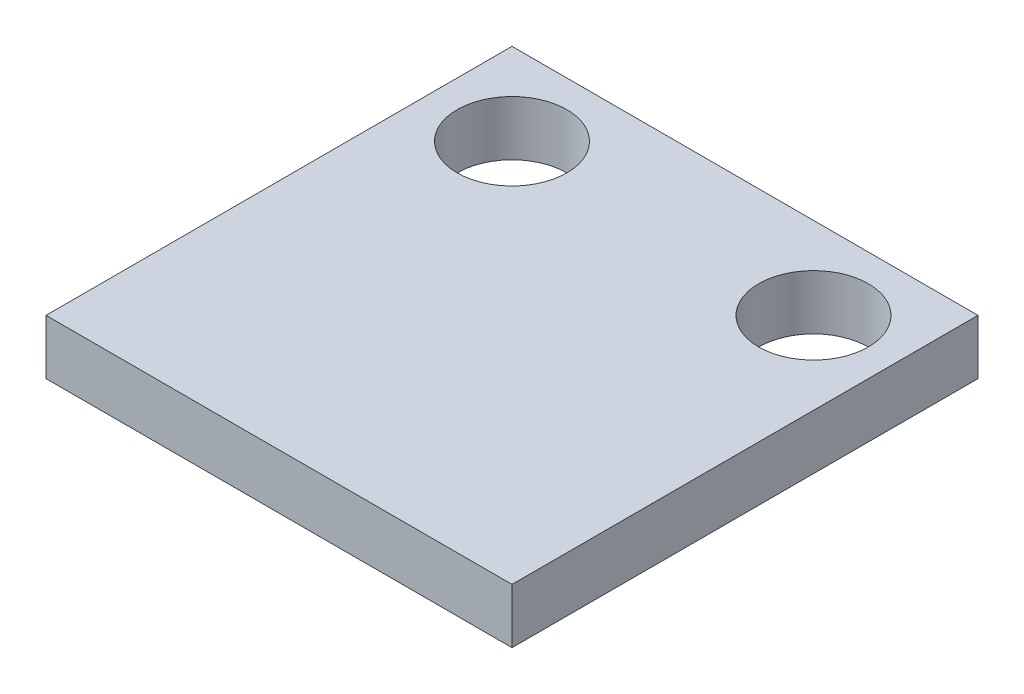
ISO-10303-21;
HEADER;
FILE_DESCRIPTION(('STEP AP214'),'2;1');
FILE_NAME('part.step','',(''),(''),'','','');
FILE_SCHEMA(('AUTOMOTIVE_DESIGN { 1 0 10303 214 1 1 1 1 }'));
ENDSEC;
DATA;
#1=APPLICATION_CONTEXT('core data for automotive mechanical design processes');
#2=APPLICATION_PROTOCOL_DEFINITION('international standard','automotive_design',2000,#1);
#3=PRODUCT_CONTEXT('',#1,'mechanical');
#4=PRODUCT('Part','Part','',(#3));
#5=PRODUCT_RELATED_PRODUCT_CATEGORY('part','',(#4));
#6=PRODUCT_DEFINITION_FORMATION('','',#4);
#7=PRODUCT_DEFINITION_CONTEXT('part definition',#1,'design');
#8=PRODUCT_DEFINITION('design','',#6,#7);
#9=PRODUCT_DEFINITION_SHAPE('','',#8);
#10=(LENGTH_UNIT() NAMED_UNIT(*) SI_UNIT(.MILLI.,.METRE.));
#11=(NAMED_UNIT(*) PLANE_ANGLE_UNIT() SI_UNIT($,.RADIAN.));
#12=(NAMED_UNIT(*) SI_UNIT($,.STERADIAN.) SOLID_ANGLE_UNIT());
#13=UNCERTAINTY_MEASURE_WITH_UNIT(LENGTH_MEASURE(1.E-05),#10,'distance_accuracy_value','');
#14=(GEOMETRIC_REPRESENTATION_CONTEXT(3) GLOBAL_UNCERTAINTY_ASSIGNED_CONTEXT((#13)) GLOBAL_UNIT_ASSIGNED_CONTEXT((#10,
#11,#12)) REPRESENTATION_CONTEXT('',''));
#15=CARTESIAN_POINT('',(0.,0.,0.));
#16=DIRECTION('',(0.,0.,1.));
#17=DIRECTION('',(1.,0.,0.));
#18=AXIS2_PLACEMENT_3D('',#15,#16,#17);
#19=CARTESIAN_POINT('',(0.,2.,0.));
#20=DIRECTION('',(0.,-1.,0.));
#21=DIRECTION('',(0.,0.,-1.));
#22=AXIS2_PLACEMENT_3D('',#19,#20,#21);
#23=PLANE('',#22);
#24=CARTESIAN_POINT('',(3.,2.,-14.));
#25=DIRECTION('',(0.,1.,0.));
#26=DIRECTION('',(0.,0.,1.));
#27=AXIS2_PLACEMENT_3D('',#24,#25,#26);
#28=CIRCLE('',#27,2.);
#29=CARTESIAN_POINT('',(3.,2.,-12.));
#30=VERTEX_POINT('',#29);
#31=EDGE_CURVE('E100',#30,#30,#28,.T.);
#32=ORIENTED_EDGE('',*,*,#31,.F.);
#33=EDGE_LOOP('',(#32));
#34=FACE_BOUND('',#33,.T.);
#35=DIRECTION('',(0.,0.,1.));
#36=VECTOR('',#35,1.);
#37=CARTESIAN_POINT('',(0.,2.,0.));
#38=LINE('',#37,#36);
#39=CARTESIAN_POINT('',(0.,2.,-17.));
#40=VERTEX_POINT('',#39);
#41=CARTESIAN_POINT('',(0.,2.,0.));
#42=VERTEX_POINT('',#41);
#43=EDGE_CURVE('E85',#40,#42,#38,.T.);
#44=ORIENTED_EDGE('',*,*,#43,.T.);
#45=DIRECTION('',(1.,0.,0.));
#46=VECTOR('',#45,1.);
#47=CARTESIAN_POINT('',(0.,2.,0.));
#48=LINE('',#47,#46);
#49=CARTESIAN_POINT('',(17.,2.,0.));
#50=VERTEX_POINT('',#49);
#51=EDGE_CURVE('E80',#42,#50,#48,.T.);
#52=ORIENTED_EDGE('',*,*,#51,.T.);
#53=DIRECTION('',(0.,0.,-1.));
#54=VECTOR('',#53,1.);
#55=CARTESIAN_POINT('',(17.,2.,0.));
#56=LINE('',#55,#54);
#57=CARTESIAN_POINT('',(17.,2.,-17.));
#58=VERTEX_POINT('',#57);
#59=EDGE_CURVE('E83',#50,#58,#56,.T.);
#60=ORIENTED_EDGE('',*,*,#59,.T.);
#61=DIRECTION('',(-1.,0.,0.));
#62=VECTOR('',#61,1.);
#63=CARTESIAN_POINT('',(0.,2.,-17.));
#64=LINE('',#63,#62);
#65=EDGE_CURVE('E50',#58,#40,#64,.T.);
#66=ORIENTED_EDGE('',*,*,#65,.T.);
#67=EDGE_LOOP('',(#44,#52,#60,#66));
#68=FACE_BOUND('',#67,.T.);
#69=CARTESIAN_POINT('',(14.,2.,-14.));
#70=DIRECTION('',(0.,1.,0.));
#71=DIRECTION('',(0.,0.,1.));
#72=AXIS2_PLACEMENT_3D('',#69,#70,#71);
#73=CIRCLE('',#72,2.);
#74=CARTESIAN_POINT('',(14.,2.,-12.));
#75=VERTEX_POINT('',#74);
#76=EDGE_CURVE('E115',#75,#75,#73,.T.);
#77=ORIENTED_EDGE('',*,*,#76,.F.);
#78=EDGE_LOOP('',(#77));
#79=FACE_BOUND('',#78,.T.);
#80=ADVANCED_FACE('F33',(#34,#68,#79),#23,.F.);
#81=CARTESIAN_POINT('',(0.,0.,0.));
#82=DIRECTION('',(0.,-1.,0.));
#83=DIRECTION('',(0.,0.,-1.));
#84=AXIS2_PLACEMENT_3D('',#81,#82,#83);
#85=PLANE('',#84);
#86=CARTESIAN_POINT('',(3.,0.,-14.));
#87=DIRECTION('',(0.,1.,0.));
#88=DIRECTION('',(0.,0.,1.));
#89=AXIS2_PLACEMENT_3D('',#86,#87,#88);
#90=CIRCLE('',#89,2.);
#91=CARTESIAN_POINT('',(3.,0.,-12.));
#92=VERTEX_POINT('',#91);
#93=EDGE_CURVE('E112',#92,#92,#90,.T.);
#94=ORIENTED_EDGE('',*,*,#93,.T.);
#95=EDGE_LOOP('',(#94));
#96=FACE_BOUND('',#95,.T.);
#97=DIRECTION('',(0.,0.,1.));
#98=VECTOR('',#97,1.);
#99=CARTESIAN_POINT('',(0.,0.,0.));
#100=LINE('',#99,#98);
#101=CARTESIAN_POINT('',(0.,0.,-17.));
#102=VERTEX_POINT('',#101);
#103=CARTESIAN_POINT('',(0.,0.,0.));
#104=VERTEX_POINT('',#103);
#105=EDGE_CURVE('E97',#102,#104,#100,.T.);
#106=ORIENTED_EDGE('',*,*,#105,.F.);
#107=DIRECTION('',(-1.,0.,0.));
#108=VECTOR('',#107,1.);
#109=CARTESIAN_POINT('',(0.,0.,-17.));
#110=LINE('',#109,#108);
#111=CARTESIAN_POINT('',(17.,0.,-17.));
#112=VERTEX_POINT('',#111);
#113=EDGE_CURVE('E73',#112,#102,#110,.T.);
#114=ORIENTED_EDGE('',*,*,#113,.F.);
#115=DIRECTION('',(0.,0.,-1.));
#116=VECTOR('',#115,1.);
#117=CARTESIAN_POINT('',(17.,0.,0.));
#118=LINE('',#117,#116);
#119=CARTESIAN_POINT('',(17.,0.,0.));
#120=VERTEX_POINT('',#119);
#121=EDGE_CURVE('E67',#120,#112,#118,.T.);
#122=ORIENTED_EDGE('',*,*,#121,.F.);
#123=DIRECTION('',(1.,0.,0.));
#124=VECTOR('',#123,1.);
#125=CARTESIAN_POINT('',(0.,0.,0.));
#126=LINE('',#125,#124);
#127=EDGE_CURVE('E89',#104,#120,#126,.T.);
#128=ORIENTED_EDGE('',*,*,#127,.F.);
#129=EDGE_LOOP('',(#106,#114,#122,#128));
#130=FACE_BOUND('',#129,.T.);
#131=CARTESIAN_POINT('',(14.,0.,-14.));
#132=DIRECTION('',(0.,1.,0.));
#133=DIRECTION('',(0.,0.,1.));
#134=AXIS2_PLACEMENT_3D('',#131,#132,#133);
#135=CIRCLE('',#134,2.);
#136=CARTESIAN_POINT('',(14.,0.,-12.));
#137=VERTEX_POINT('',#136);
#138=EDGE_CURVE('E118',#137,#137,#135,.T.);
#139=ORIENTED_EDGE('',*,*,#138,.T.);
#140=EDGE_LOOP('',(#139));
#141=FACE_BOUND('',#140,.T.);
#142=ADVANCED_FACE('F108',(#96,#130,#141),#85,.T.);
#143=CARTESIAN_POINT('',(0.,2.,0.));
#144=DIRECTION('',(1.,0.,0.));
#145=DIRECTION('',(0.,0.,-1.));
#146=AXIS2_PLACEMENT_3D('',#143,#144,#145);
#147=PLANE('',#146);
#148=ORIENTED_EDGE('',*,*,#105,.T.);
#149=DIRECTION('',(0.,-1.,0.));
#150=VECTOR('',#149,1.);
#151=CARTESIAN_POINT('',(0.,2.,0.));
#152=LINE('',#151,#150);
#153=EDGE_CURVE('E11',#42,#104,#152,.T.);
#154=ORIENTED_EDGE('',*,*,#153,.F.);
#155=ORIENTED_EDGE('',*,*,#43,.F.);
#156=DIRECTION('',(0.,-1.,0.));
#157=VECTOR('',#156,1.);
#158=CARTESIAN_POINT('',(0.,2.,-17.));
#159=LINE('',#158,#157);
#160=EDGE_CURVE('E93',#40,#102,#159,.T.);
#161=ORIENTED_EDGE('',*,*,#160,.T.);
#162=EDGE_LOOP('',(#148,#154,#155,#161));
#163=FACE_BOUND('',#162,.T.);
#164=ADVANCED_FACE('F35',(#163),#147,.F.);
#165=CARTESIAN_POINT('',(0.,2.,0.));
#166=DIRECTION('',(0.,0.,-1.));
#167=DIRECTION('',(-1.,0.,0.));
#168=AXIS2_PLACEMENT_3D('',#165,#166,#167);
#169=PLANE('',#168);
#170=ORIENTED_EDGE('',*,*,#127,.T.);
#171=DIRECTION('',(0.,-1.,0.));
#172=VECTOR('',#171,1.);
#173=CARTESIAN_POINT('',(17.,2.,0.));
#174=LINE('',#173,#172);
#175=EDGE_CURVE('E42',#50,#120,#174,.T.);
#176=ORIENTED_EDGE('',*,*,#175,.F.);
#177=ORIENTED_EDGE('',*,*,#51,.F.);
#178=ORIENTED_EDGE('',*,*,#153,.T.);
#179=EDGE_LOOP('',(#170,#176,#177,#178));
#180=FACE_BOUND('',#179,.T.);
#181=ADVANCED_FACE('F88',(#180),#169,.F.);
#182=CARTESIAN_POINT('',(17.,2.,0.));
#183=DIRECTION('',(-1.,0.,0.));
#184=DIRECTION('',(0.,0.,1.));
#185=AXIS2_PLACEMENT_3D('',#182,#183,#184);
#186=PLANE('',#185);
#187=ORIENTED_EDGE('',*,*,#121,.T.);
#188=DIRECTION('',(0.,-1.,0.));
#189=VECTOR('',#188,1.);
#190=CARTESIAN_POINT('',(17.,2.,-17.));
#191=LINE('',#190,#189);
#192=EDGE_CURVE('E90',#58,#112,#191,.T.);
#193=ORIENTED_EDGE('',*,*,#192,.F.);
#194=ORIENTED_EDGE('',*,*,#59,.F.);
#195=ORIENTED_EDGE('',*,*,#175,.T.);
#196=EDGE_LOOP('',(#187,#193,#194,#195));
#197=FACE_BOUND('',#196,.T.);
#198=ADVANCED_FACE('F91',(#197),#186,.F.);
#199=CARTESIAN_POINT('',(0.,2.,-17.));
#200=DIRECTION('',(0.,0.,1.));
#201=DIRECTION('',(1.,0.,0.));
#202=AXIS2_PLACEMENT_3D('',#199,#200,#201);
#203=PLANE('',#202);
#204=ORIENTED_EDGE('',*,*,#113,.T.);
#205=ORIENTED_EDGE('',*,*,#160,.F.);
#206=ORIENTED_EDGE('',*,*,#65,.F.);
#207=ORIENTED_EDGE('',*,*,#192,.T.);
#208=EDGE_LOOP('',(#204,#205,#206,#207));
#209=FACE_BOUND('',#208,.T.);
#210=ADVANCED_FACE('F105',(#209),#203,.F.);
#211=CARTESIAN_POINT('',(3.,2.,-14.));
#212=DIRECTION('',(0.,-1.,0.));
#213=DIRECTION('',(0.,0.,-1.));
#214=AXIS2_PLACEMENT_3D('',#211,#212,#213);
#215=CYLINDRICAL_SURFACE('',#214,2.);
#216=ORIENTED_EDGE('',*,*,#31,.T.);
#217=EDGE_LOOP('',(#216));
#218=FACE_BOUND('',#217,.T.);
#219=ORIENTED_EDGE('',*,*,#93,.F.);
#220=EDGE_LOOP('',(#219));
#221=FACE_BOUND('',#220,.T.);
#222=ADVANCED_FACE('F136',(#218,#221),#215,.F.);
#223=CARTESIAN_POINT('',(14.,2.,-14.));
#224=DIRECTION('',(0.,-1.,0.));
#225=DIRECTION('',(0.,0.,-1.));
#226=AXIS2_PLACEMENT_3D('',#223,#224,#225);
#227=CYLINDRICAL_SURFACE('',#226,2.);
#228=ORIENTED_EDGE('',*,*,#76,.T.);
#229=EDGE_LOOP('',(#228));
#230=FACE_BOUND('',#229,.T.);
#231=ORIENTED_EDGE('',*,*,#138,.F.);
#232=EDGE_LOOP('',(#231));
#233=FACE_BOUND('',#232,.T.);
#234=ADVANCED_FACE('F124',(#230,#233),#227,.F.);
#235=CLOSED_SHELL('',(#80,#142,#164,#181,#198,#210,#222,#234));
#236=MANIFOLD_SOLID_BREP('B2',#235);
#237=ADVANCED_BREP_SHAPE_REPRESENTATION('',(#18,#236),#14);
#238=SHAPE_DEFINITION_REPRESENTATION(#9,#237);
ENDSEC;
END-ISO-10303-21;
